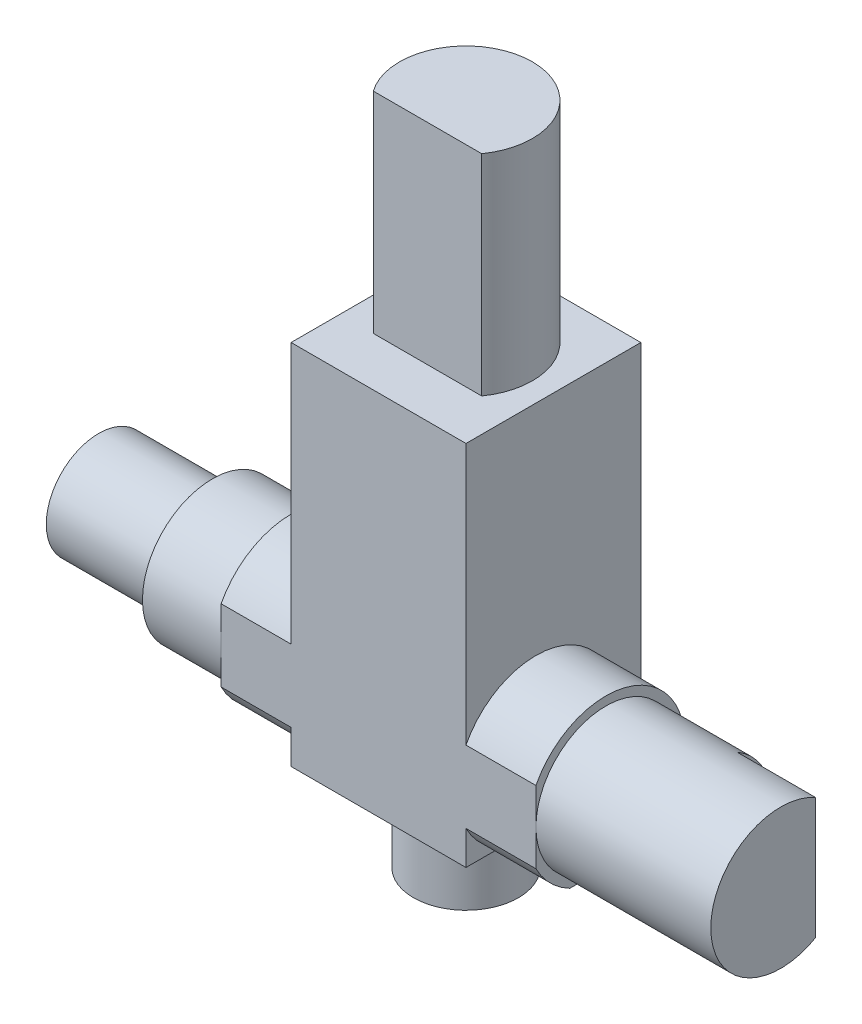
ISO-10303-21;
HEADER;
FILE_DESCRIPTION(('STEP AP214'),'2;1');
FILE_NAME('part.step','',(''),(''),'','','');
FILE_SCHEMA(('AUTOMOTIVE_DESIGN { 1 0 10303 214 1 1 1 1 }'));
ENDSEC;
DATA;
#1=APPLICATION_CONTEXT('core data for automotive mechanical design processes');
#2=APPLICATION_PROTOCOL_DEFINITION('international standard','automotive_design',2000,#1);
#3=PRODUCT_CONTEXT('',#1,'mechanical');
#4=PRODUCT('Part','Part','',(#3));
#5=PRODUCT_RELATED_PRODUCT_CATEGORY('part','',(#4));
#6=PRODUCT_DEFINITION_FORMATION('','',#4);
#7=PRODUCT_DEFINITION_CONTEXT('part definition',#1,'design');
#8=PRODUCT_DEFINITION('design','',#6,#7);
#9=PRODUCT_DEFINITION_SHAPE('','',#8);
#10=(LENGTH_UNIT() NAMED_UNIT(*) SI_UNIT(.MILLI.,.METRE.));
#11=(NAMED_UNIT(*) PLANE_ANGLE_UNIT() SI_UNIT($,.RADIAN.));
#12=(NAMED_UNIT(*) SI_UNIT($,.STERADIAN.) SOLID_ANGLE_UNIT());
#13=UNCERTAINTY_MEASURE_WITH_UNIT(LENGTH_MEASURE(1.E-05),#10,'distance_accuracy_value','');
#14=(GEOMETRIC_REPRESENTATION_CONTEXT(3) GLOBAL_UNCERTAINTY_ASSIGNED_CONTEXT((#13)) GLOBAL_UNIT_ASSIGNED_CONTEXT((#10,
#11,#12)) REPRESENTATION_CONTEXT('',''));
#15=CARTESIAN_POINT('',(0.,0.,0.));
#16=DIRECTION('',(0.,0.,1.));
#17=DIRECTION('',(1.,0.,0.));
#18=AXIS2_PLACEMENT_3D('',#15,#16,#17);
#19=CARTESIAN_POINT('',(-9.5,4.5,0.5));
#20=DIRECTION('',(1.,0.,0.));
#21=DIRECTION('',(0.,0.,-1.));
#22=AXIS2_PLACEMENT_3D('',#19,#20,#21);
#23=CYLINDRICAL_SURFACE('',#22,2.);
#24=CARTESIAN_POINT('',(-4.5,4.5,0.5));
#25=DIRECTION('',(1.,0.,0.));
#26=DIRECTION('',(0.,0.,-1.));
#27=AXIS2_PLACEMENT_3D('',#24,#25,#26);
#28=CIRCLE('',#27,2.);
#29=CARTESIAN_POINT('',(-4.5,4.5,2.5));
#30=VERTEX_POINT('',#29);
#31=CARTESIAN_POINT('',(-4.5,2.5,0.5));
#32=VERTEX_POINT('',#31);
#33=EDGE_CURVE('E60',#30,#32,#28,.T.);
#34=ORIENTED_EDGE('',*,*,#33,.F.);
#35=EDGE_CURVE('E187',#32,#30,#28,.T.);
#36=ORIENTED_EDGE('',*,*,#35,.F.);
#37=EDGE_LOOP('',(#34,#36));
#38=FACE_BOUND('',#37,.T.);
#39=CARTESIAN_POINT('',(-6.75,4.5,0.5));
#40=DIRECTION('',(-1.,0.,0.));
#41=DIRECTION('',(0.,0.,1.));
#42=AXIS2_PLACEMENT_3D('',#39,#40,#41);
#43=CIRCLE('',#42,2.);
#44=CARTESIAN_POINT('',(-6.75,4.5,2.5));
#45=VERTEX_POINT('',#44);
#46=EDGE_CURVE('E169',#45,#45,#43,.T.);
#47=ORIENTED_EDGE('',*,*,#46,.F.);
#48=EDGE_LOOP('',(#47));
#49=FACE_BOUND('',#48,.T.);
#50=ADVANCED_FACE('F38',(#38,#49),#23,.T.);
#51=CARTESIAN_POINT('',(-4.5,0.,0.));
#52=DIRECTION('',(-1.,0.,0.));
#53=DIRECTION('',(0.,0.,-1.));
#54=AXIS2_PLACEMENT_3D('',#51,#52,#53);
#55=PLANE('',#54);
#56=DIRECTION('',(0.,-1.,0.));
#57=VECTOR('',#56,1.);
#58=CARTESIAN_POINT('',(-4.5,0.,2.5));
#59=LINE('',#58,#57);
#60=CARTESIAN_POINT('',(-4.5,3.46922359359559,2.5));
#61=VERTEX_POINT('',#60);
#62=EDGE_CURVE('E192',#30,#61,#59,.T.);
#63=ORIENTED_EDGE('',*,*,#62,.F.);
#64=ORIENTED_EDGE('',*,*,#33,.T.);
#65=DIRECTION('',(0.,0.,-1.));
#66=VECTOR('',#65,1.);
#67=CARTESIAN_POINT('',(-4.5,2.5,0.));
#68=LINE('',#67,#66);
#69=CARTESIAN_POINT('',(-4.5,2.5,1.53077640640442));
#70=VERTEX_POINT('',#69);
#71=EDGE_CURVE('E196',#70,#32,#68,.T.);
#72=ORIENTED_EDGE('',*,*,#71,.F.);
#73=CARTESIAN_POINT('',(-4.5,4.5,0.5));
#74=DIRECTION('',(1.,0.,0.));
#75=DIRECTION('',(0.,0.,-1.));
#76=AXIS2_PLACEMENT_3D('',#73,#74,#75);
#77=CIRCLE('',#76,2.25);
#78=EDGE_CURVE('E199',#61,#70,#77,.T.);
#79=ORIENTED_EDGE('',*,*,#78,.F.);
#80=EDGE_LOOP('',(#63,#64,#72,#79));
#81=FACE_BOUND('',#80,.T.);
#82=ADVANCED_FACE('F349',(#81),#55,.T.);
#83=CARTESIAN_POINT('',(-2.5,13.,2.5));
#84=DIRECTION('',(1.,0.,0.));
#85=DIRECTION('',(0.,0.,-1.));
#86=AXIS2_PLACEMENT_3D('',#83,#84,#85);
#87=PLANE('',#86);
#88=DIRECTION('',(0.,-1.,0.));
#89=VECTOR('',#88,1.);
#90=CARTESIAN_POINT('',(-2.5,13.,2.5));
#91=LINE('',#90,#89);
#92=CARTESIAN_POINT('',(-2.5,3.46922359359559,2.5));
#93=VERTEX_POINT('',#92);
#94=CARTESIAN_POINT('',(-2.5,2.5,2.5));
#95=VERTEX_POINT('',#94);
#96=EDGE_CURVE('E292',#93,#95,#91,.T.);
#97=ORIENTED_EDGE('',*,*,#96,.F.);
#98=CARTESIAN_POINT('',(-2.5,4.5,0.5));
#99=DIRECTION('',(1.,0.,0.));
#100=DIRECTION('',(0.,0.,-1.));
#101=AXIS2_PLACEMENT_3D('',#98,#99,#100);
#102=CIRCLE('',#101,2.25);
#103=CARTESIAN_POINT('',(-2.5,2.5,1.53077640640442));
#104=VERTEX_POINT('',#103);
#105=EDGE_CURVE('E205',#93,#104,#102,.T.);
#106=ORIENTED_EDGE('',*,*,#105,.T.);
#107=DIRECTION('',(0.,0.,1.));
#108=VECTOR('',#107,1.);
#109=CARTESIAN_POINT('',(-2.5,2.5,2.5));
#110=LINE('',#109,#108);
#111=EDGE_CURVE('E258',#104,#95,#110,.T.);
#112=ORIENTED_EDGE('',*,*,#111,.T.);
#113=EDGE_LOOP('',(#97,#106,#112));
#114=FACE_BOUND('',#113,.T.);
#115=ADVANCED_FACE('F344',(#114),#87,.F.);
#116=CARTESIAN_POINT('',(4.5,0.,0.));
#117=DIRECTION('',(1.,0.,0.));
#118=DIRECTION('',(0.,0.,-1.));
#119=AXIS2_PLACEMENT_3D('',#116,#117,#118);
#120=PLANE('',#119);
#121=CARTESIAN_POINT('',(4.5,4.5,0.5));
#122=DIRECTION('',(1.,0.,0.));
#123=DIRECTION('',(0.,0.,-1.));
#124=AXIS2_PLACEMENT_3D('',#121,#122,#123);
#125=CIRCLE('',#124,2.);
#126=CARTESIAN_POINT('',(4.5,4.5,2.5));
#127=VERTEX_POINT('',#126);
#128=CARTESIAN_POINT('',(4.5,2.5,0.5));
#129=VERTEX_POINT('',#128);
#130=EDGE_CURVE('E215',#127,#129,#125,.T.);
#131=ORIENTED_EDGE('',*,*,#130,.F.);
#132=DIRECTION('',(0.,-1.,0.));
#133=VECTOR('',#132,1.);
#134=CARTESIAN_POINT('',(4.5,0.,2.5));
#135=LINE('',#134,#133);
#136=CARTESIAN_POINT('',(4.5,3.46922359359559,2.5));
#137=VERTEX_POINT('',#136);
#138=EDGE_CURVE('E224',#127,#137,#135,.T.);
#139=ORIENTED_EDGE('',*,*,#138,.T.);
#140=CARTESIAN_POINT('',(4.5,4.5,0.5));
#141=DIRECTION('',(1.,0.,0.));
#142=DIRECTION('',(0.,0.,-1.));
#143=AXIS2_PLACEMENT_3D('',#140,#141,#142);
#144=CIRCLE('',#143,2.25);
#145=CARTESIAN_POINT('',(4.5,2.5,1.53077640640442));
#146=VERTEX_POINT('',#145);
#147=EDGE_CURVE('E223',#137,#146,#144,.T.);
#148=ORIENTED_EDGE('',*,*,#147,.T.);
#149=DIRECTION('',(0.,0.,-1.));
#150=VECTOR('',#149,1.);
#151=CARTESIAN_POINT('',(4.5,2.5,0.));
#152=LINE('',#151,#150);
#153=EDGE_CURVE('E227',#146,#129,#152,.T.);
#154=ORIENTED_EDGE('',*,*,#153,.T.);
#155=EDGE_LOOP('',(#131,#139,#148,#154));
#156=FACE_BOUND('',#155,.T.);
#157=ADVANCED_FACE('F325',(#156),#120,.T.);
#158=CARTESIAN_POINT('',(2.5,13.,2.5));
#159=DIRECTION('',(-1.,0.,0.));
#160=DIRECTION('',(0.,0.,1.));
#161=AXIS2_PLACEMENT_3D('',#158,#159,#160);
#162=PLANE('',#161);
#163=CARTESIAN_POINT('',(2.5,4.5,0.5));
#164=DIRECTION('',(1.,0.,0.));
#165=DIRECTION('',(0.,0.,-1.));
#166=AXIS2_PLACEMENT_3D('',#163,#164,#165);
#167=CIRCLE('',#166,2.25);
#168=CARTESIAN_POINT('',(2.5,2.5,-0.530776406404414));
#169=VERTEX_POINT('',#168);
#170=CARTESIAN_POINT('',(2.5,5.53077640640442,2.5));
#171=VERTEX_POINT('',#170);
#172=EDGE_CURVE('E235',#169,#171,#167,.T.);
#173=ORIENTED_EDGE('',*,*,#172,.F.);
#174=DIRECTION('',(0.,0.,-1.));
#175=VECTOR('',#174,1.);
#176=CARTESIAN_POINT('',(2.5,2.5,2.5));
#177=LINE('',#176,#175);
#178=CARTESIAN_POINT('',(2.5,2.5,-2.5));
#179=VERTEX_POINT('',#178);
#180=EDGE_CURVE('E280',#169,#179,#177,.T.);
#181=ORIENTED_EDGE('',*,*,#180,.T.);
#182=DIRECTION('',(0.,-1.,0.));
#183=VECTOR('',#182,1.);
#184=CARTESIAN_POINT('',(2.5,13.,-2.5));
#185=LINE('',#184,#183);
#186=CARTESIAN_POINT('',(2.5,13.,-2.5));
#187=VERTEX_POINT('',#186);
#188=EDGE_CURVE('E286',#187,#179,#185,.T.);
#189=ORIENTED_EDGE('',*,*,#188,.F.);
#190=DIRECTION('',(0.,0.,-1.));
#191=VECTOR('',#190,1.);
#192=CARTESIAN_POINT('',(2.5,13.,2.5));
#193=LINE('',#192,#191);
#194=CARTESIAN_POINT('',(2.5,13.,2.5));
#195=VERTEX_POINT('',#194);
#196=EDGE_CURVE('E269',#195,#187,#193,.T.);
#197=ORIENTED_EDGE('',*,*,#196,.F.);
#198=DIRECTION('',(0.,-1.,0.));
#199=VECTOR('',#198,1.);
#200=CARTESIAN_POINT('',(2.5,13.,2.5));
#201=LINE('',#200,#199);
#202=EDGE_CURVE('E290',#195,#171,#201,.T.);
#203=ORIENTED_EDGE('',*,*,#202,.T.);
#204=EDGE_LOOP('',(#173,#181,#189,#197,#203));
#205=FACE_BOUND('',#204,.T.);
#206=ADVANCED_FACE('F546',(#205),#162,.F.);
#207=CARTESIAN_POINT('',(0.,2.,0.));
#208=DIRECTION('',(0.,-1.,0.));
#209=DIRECTION('',(0.,0.,-1.));
#210=AXIS2_PLACEMENT_3D('',#207,#208,#209);
#211=CYLINDRICAL_SURFACE('',#210,1.5);
#212=CARTESIAN_POINT('',(0.,2.,0.));
#213=DIRECTION('',(0.,1.,0.));
#214=DIRECTION('',(0.,0.,1.));
#215=AXIS2_PLACEMENT_3D('',#212,#213,#214);
#216=CIRCLE('',#215,1.5);
#217=CARTESIAN_POINT('',(0.,2.,1.5));
#218=VERTEX_POINT('',#217);
#219=EDGE_CURVE('E262',#218,#218,#216,.T.);
#220=ORIENTED_EDGE('',*,*,#219,.F.);
#221=EDGE_LOOP('',(#220));
#222=FACE_BOUND('',#221,.T.);
#223=CARTESIAN_POINT('',(0.,0.,0.));
#224=DIRECTION('',(0.,1.,0.));
#225=DIRECTION('',(0.,0.,1.));
#226=AXIS2_PLACEMENT_3D('',#223,#224,#225);
#227=CIRCLE('',#226,1.5);
#228=CARTESIAN_POINT('',(0.,0.,1.5));
#229=VERTEX_POINT('',#228);
#230=EDGE_CURVE('E300',#229,#229,#227,.T.);
#231=ORIENTED_EDGE('',*,*,#230,.T.);
#232=EDGE_LOOP('',(#231));
#233=FACE_BOUND('',#232,.T.);
#234=ADVANCED_FACE('F40',(#222,#233),#211,.T.);
#235=CARTESIAN_POINT('',(0.,0.,0.));
#236=DIRECTION('',(0.,1.,0.));
#237=DIRECTION('',(0.,0.,1.));
#238=AXIS2_PLACEMENT_3D('',#235,#236,#237);
#239=PLANE('',#238);
#240=ORIENTED_EDGE('',*,*,#230,.F.);
#241=EDGE_LOOP('',(#240));
#242=FACE_BOUND('',#241,.T.);
#243=ADVANCED_FACE('F611',(#242),#239,.F.);
#244=CARTESIAN_POINT('',(0.,2.5,0.));
#245=DIRECTION('',(0.,-1.,0.));
#246=DIRECTION('',(0.,0.,-1.));
#247=AXIS2_PLACEMENT_3D('',#244,#245,#246);
#248=CYLINDRICAL_SURFACE('',#247,2.);
#249=CARTESIAN_POINT('',(0.,2.5,0.));
#250=DIRECTION('',(0.,1.,0.));
#251=DIRECTION('',(0.,0.,1.));
#252=AXIS2_PLACEMENT_3D('',#249,#250,#251);
#253=CIRCLE('',#252,2.);
#254=CARTESIAN_POINT('',(0.,2.5,2.));
#255=VERTEX_POINT('',#254);
#256=EDGE_CURVE('E297',#255,#255,#253,.T.);
#257=ORIENTED_EDGE('',*,*,#256,.F.);
#258=EDGE_LOOP('',(#257));
#259=FACE_BOUND('',#258,.T.);
#260=CARTESIAN_POINT('',(0.,2.,0.));
#261=DIRECTION('',(0.,1.,0.));
#262=DIRECTION('',(0.,0.,1.));
#263=AXIS2_PLACEMENT_3D('',#260,#261,#262);
#264=CIRCLE('',#263,2.);
#265=CARTESIAN_POINT('',(0.,2.,2.));
#266=VERTEX_POINT('',#265);
#267=EDGE_CURVE('E296',#266,#266,#264,.T.);
#268=ORIENTED_EDGE('',*,*,#267,.T.);
#269=EDGE_LOOP('',(#268));
#270=FACE_BOUND('',#269,.T.);
#271=ADVANCED_FACE('F601',(#259,#270),#248,.T.);
#272=CARTESIAN_POINT('',(0.,2.,0.));
#273=DIRECTION('',(0.,1.,0.));
#274=DIRECTION('',(0.,0.,1.));
#275=AXIS2_PLACEMENT_3D('',#272,#273,#274);
#276=PLANE('',#275);
#277=ORIENTED_EDGE('',*,*,#219,.T.);
#278=EDGE_LOOP('',(#277));
#279=FACE_BOUND('',#278,.T.);
#280=ORIENTED_EDGE('',*,*,#267,.F.);
#281=EDGE_LOOP('',(#280));
#282=FACE_BOUND('',#281,.T.);
#283=ADVANCED_FACE('F513',(#279,#282),#276,.F.);
#284=CARTESIAN_POINT('',(-2.5,2.5,-2.5));
#285=VERTEX_POINT('',#284);
#286=CARTESIAN_POINT('',(-2.5,2.5,-0.530776406404414));
#287=VERTEX_POINT('',#286);
#288=EDGE_CURVE('E274',#285,#287,#110,.T.);
#289=ORIENTED_EDGE('',*,*,#288,.T.);
#290=CARTESIAN_POINT('',(-2.5,4.5,0.5));
#291=DIRECTION('',(1.,0.,0.));
#292=DIRECTION('',(0.,0.,-1.));
#293=AXIS2_PLACEMENT_3D('',#290,#291,#292);
#294=CIRCLE('',#293,2.25);
#295=CARTESIAN_POINT('',(-2.5,5.53077640640442,2.5));
#296=VERTEX_POINT('',#295);
#297=EDGE_CURVE('E186',#287,#296,#294,.T.);
#298=ORIENTED_EDGE('',*,*,#297,.T.);
#299=CARTESIAN_POINT('',(-2.5,13.,2.5));
#300=VERTEX_POINT('',#299);
#301=EDGE_CURVE('E293',#300,#296,#91,.T.);
#302=ORIENTED_EDGE('',*,*,#301,.F.);
#303=DIRECTION('',(0.,0.,1.));
#304=VECTOR('',#303,1.);
#305=CARTESIAN_POINT('',(-2.5,13.,2.5));
#306=LINE('',#305,#304);
#307=CARTESIAN_POINT('',(-2.5,13.,-2.5));
#308=VERTEX_POINT('',#307);
#309=EDGE_CURVE('E263',#308,#300,#306,.T.);
#310=ORIENTED_EDGE('',*,*,#309,.F.);
#311=DIRECTION('',(0.,-1.,0.));
#312=VECTOR('',#311,1.);
#313=CARTESIAN_POINT('',(-2.5,13.,-2.5));
#314=LINE('',#313,#312);
#315=EDGE_CURVE('E273',#308,#285,#314,.T.);
#316=ORIENTED_EDGE('',*,*,#315,.T.);
#317=EDGE_LOOP('',(#289,#298,#302,#310,#316));
#318=FACE_BOUND('',#317,.T.);
#319=ADVANCED_FACE('F502',(#318),#87,.F.);
#320=CARTESIAN_POINT('',(2.5,13.,2.5));
#321=DIRECTION('',(0.,0.,-1.));
#322=DIRECTION('',(-1.,0.,0.));
#323=AXIS2_PLACEMENT_3D('',#320,#321,#322);
#324=PLANE('',#323);
#325=DIRECTION('',(1.,0.,0.));
#326=VECTOR('',#325,1.);
#327=CARTESIAN_POINT('',(2.5,2.5,2.5));
#328=LINE('',#327,#326);
#329=CARTESIAN_POINT('',(2.5,2.5,2.5));
#330=VERTEX_POINT('',#329);
#331=EDGE_CURVE('E277',#95,#330,#328,.T.);
#332=ORIENTED_EDGE('',*,*,#331,.T.);
#333=CARTESIAN_POINT('',(2.5,3.46922359359559,2.5));
#334=VERTEX_POINT('',#333);
#335=EDGE_CURVE('E289',#334,#330,#201,.T.);
#336=ORIENTED_EDGE('',*,*,#335,.F.);
#337=DIRECTION('',(-1.,0.,0.));
#338=VECTOR('',#337,1.);
#339=CARTESIAN_POINT('',(4.5,3.46922359359559,2.5));
#340=LINE('',#339,#338);
#341=EDGE_CURVE('E246',#137,#334,#340,.T.);
#342=ORIENTED_EDGE('',*,*,#341,.F.);
#343=ORIENTED_EDGE('',*,*,#138,.F.);
#344=CARTESIAN_POINT('',(4.5,5.53077640640442,2.5));
#345=VERTEX_POINT('',#344);
#346=EDGE_CURVE('E221',#345,#127,#135,.T.);
#347=ORIENTED_EDGE('',*,*,#346,.F.);
#348=DIRECTION('',(-1.,0.,0.));
#349=VECTOR('',#348,1.);
#350=CARTESIAN_POINT('',(4.5,5.53077640640442,2.5));
#351=LINE('',#350,#349);
#352=EDGE_CURVE('E232',#345,#171,#351,.T.);
#353=ORIENTED_EDGE('',*,*,#352,.T.);
#354=ORIENTED_EDGE('',*,*,#202,.F.);
#355=DIRECTION('',(1.,0.,0.));
#356=VECTOR('',#355,1.);
#357=CARTESIAN_POINT('',(2.5,13.,2.5));
#358=LINE('',#357,#356);
#359=EDGE_CURVE('E266',#300,#195,#358,.T.);
#360=ORIENTED_EDGE('',*,*,#359,.F.);
#361=ORIENTED_EDGE('',*,*,#301,.T.);
#362=DIRECTION('',(1.,0.,0.));
#363=VECTOR('',#362,1.);
#364=CARTESIAN_POINT('',(-4.5,5.53077640640442,2.5));
#365=LINE('',#364,#363);
#366=CARTESIAN_POINT('',(-4.5,5.53077640640442,2.5));
#367=VERTEX_POINT('',#366);
#368=EDGE_CURVE('E213',#367,#296,#365,.T.);
#369=ORIENTED_EDGE('',*,*,#368,.F.);
#370=EDGE_CURVE('E188',#367,#30,#59,.T.);
#371=ORIENTED_EDGE('',*,*,#370,.T.);
#372=ORIENTED_EDGE('',*,*,#62,.T.);
#373=DIRECTION('',(1.,0.,0.));
#374=VECTOR('',#373,1.);
#375=CARTESIAN_POINT('',(-4.5,3.46922359359559,2.5));
#376=LINE('',#375,#374);
#377=EDGE_CURVE('E202',#61,#93,#376,.T.);
#378=ORIENTED_EDGE('',*,*,#377,.T.);
#379=ORIENTED_EDGE('',*,*,#96,.T.);
#380=EDGE_LOOP('',(#332,#336,#342,#343,#347,#353,#354,#360,#361,#369,#371,#372,#378,#379));
#381=FACE_BOUND('',#380,.T.);
#382=ADVANCED_FACE('F338',(#381),#324,.F.);
#383=CARTESIAN_POINT('',(2.5,4.5,0.5));
#384=DIRECTION('',(1.,0.,0.));
#385=DIRECTION('',(0.,0.,-1.));
#386=AXIS2_PLACEMENT_3D('',#383,#384,#385);
#387=CIRCLE('',#386,2.25);
#388=CARTESIAN_POINT('',(2.5,2.5,1.53077640640442));
#389=VERTEX_POINT('',#388);
#390=EDGE_CURVE('E217',#334,#389,#387,.T.);
#391=ORIENTED_EDGE('',*,*,#390,.F.);
#392=ORIENTED_EDGE('',*,*,#335,.T.);
#393=EDGE_CURVE('E281',#330,#389,#177,.T.);
#394=ORIENTED_EDGE('',*,*,#393,.T.);
#395=EDGE_LOOP('',(#391,#392,#394));
#396=FACE_BOUND('',#395,.T.);
#397=ADVANCED_FACE('F335',(#396),#162,.F.);
#398=CARTESIAN_POINT('',(2.5,13.,-2.5));
#399=DIRECTION('',(0.,0.,1.));
#400=DIRECTION('',(1.,0.,0.));
#401=AXIS2_PLACEMENT_3D('',#398,#399,#400);
#402=PLANE('',#401);
#403=DIRECTION('',(-1.,0.,0.));
#404=VECTOR('',#403,1.);
#405=CARTESIAN_POINT('',(2.5,2.5,-2.5));
#406=LINE('',#405,#404);
#407=EDGE_CURVE('E267',#179,#285,#406,.T.);
#408=ORIENTED_EDGE('',*,*,#407,.T.);
#409=ORIENTED_EDGE('',*,*,#315,.F.);
#410=DIRECTION('',(-1.,0.,0.));
#411=VECTOR('',#410,1.);
#412=CARTESIAN_POINT('',(2.5,13.,-2.5));
#413=LINE('',#412,#411);
#414=EDGE_CURVE('E271',#187,#308,#413,.T.);
#415=ORIENTED_EDGE('',*,*,#414,.F.);
#416=ORIENTED_EDGE('',*,*,#188,.T.);
#417=EDGE_LOOP('',(#408,#409,#415,#416));
#418=FACE_BOUND('',#417,.T.);
#419=ADVANCED_FACE('F432',(#418),#402,.F.);
#420=CARTESIAN_POINT('',(0.,13.,0.));
#421=DIRECTION('',(0.,1.,0.));
#422=DIRECTION('',(0.,0.,1.));
#423=AXIS2_PLACEMENT_3D('',#420,#421,#422);
#424=PLANE('',#423);
#425=CARTESIAN_POINT('',(0.,13.,0.));
#426=DIRECTION('',(0.,1.,0.));
#427=DIRECTION('',(0.,0.,1.));
#428=AXIS2_PLACEMENT_3D('',#425,#426,#427);
#429=CIRCLE('',#428,1.9);
#430=CARTESIAN_POINT('',(1.54919333848297,13.,1.1));
#431=VERTEX_POINT('',#430);
#432=CARTESIAN_POINT('',(-1.54919333848297,13.,1.1));
#433=VERTEX_POINT('',#432);
#434=EDGE_CURVE('E259',#431,#433,#429,.T.);
#435=ORIENTED_EDGE('',*,*,#434,.F.);
#436=DIRECTION('',(1.,0.,0.));
#437=VECTOR('',#436,1.);
#438=CARTESIAN_POINT('',(-1.54919333848297,13.,1.1));
#439=LINE('',#438,#437);
#440=EDGE_CURVE('E180',#433,#431,#439,.T.);
#441=ORIENTED_EDGE('',*,*,#440,.F.);
#442=EDGE_LOOP('',(#435,#441));
#443=FACE_BOUND('',#442,.T.);
#444=ORIENTED_EDGE('',*,*,#309,.T.);
#445=ORIENTED_EDGE('',*,*,#359,.T.);
#446=ORIENTED_EDGE('',*,*,#196,.T.);
#447=ORIENTED_EDGE('',*,*,#414,.T.);
#448=EDGE_LOOP('',(#444,#445,#446,#447));
#449=FACE_BOUND('',#448,.T.);
#450=ADVANCED_FACE('F427',(#443,#449),#424,.T.);
#451=CARTESIAN_POINT('',(0.,2.5,0.));
#452=DIRECTION('',(0.,1.,0.));
#453=DIRECTION('',(0.,0.,1.));
#454=AXIS2_PLACEMENT_3D('',#451,#452,#453);
#455=PLANE('',#454);
#456=ORIENTED_EDGE('',*,*,#256,.T.);
#457=EDGE_LOOP('',(#456));
#458=FACE_BOUND('',#457,.T.);
#459=ORIENTED_EDGE('',*,*,#288,.F.);
#460=ORIENTED_EDGE('',*,*,#407,.F.);
#461=ORIENTED_EDGE('',*,*,#180,.F.);
#462=DIRECTION('',(-1.,0.,0.));
#463=VECTOR('',#462,1.);
#464=CARTESIAN_POINT('',(4.5,2.5,-0.530776406404414));
#465=LINE('',#464,#463);
#466=CARTESIAN_POINT('',(4.5,2.5,-0.530776406404414));
#467=VERTEX_POINT('',#466);
#468=EDGE_CURVE('E240',#467,#169,#465,.T.);
#469=ORIENTED_EDGE('',*,*,#468,.F.);
#470=EDGE_CURVE('E226',#129,#467,#152,.T.);
#471=ORIENTED_EDGE('',*,*,#470,.F.);
#472=ORIENTED_EDGE('',*,*,#153,.F.);
#473=DIRECTION('',(-1.,0.,0.));
#474=VECTOR('',#473,1.);
#475=CARTESIAN_POINT('',(4.5,2.5,1.53077640640442));
#476=LINE('',#475,#474);
#477=EDGE_CURVE('E243',#146,#389,#476,.T.);
#478=ORIENTED_EDGE('',*,*,#477,.T.);
#479=ORIENTED_EDGE('',*,*,#393,.F.);
#480=ORIENTED_EDGE('',*,*,#331,.F.);
#481=ORIENTED_EDGE('',*,*,#111,.F.);
#482=DIRECTION('',(1.,0.,0.));
#483=VECTOR('',#482,1.);
#484=CARTESIAN_POINT('',(-4.5,2.5,1.53077640640442));
#485=LINE('',#484,#483);
#486=EDGE_CURVE('E209',#70,#104,#485,.T.);
#487=ORIENTED_EDGE('',*,*,#486,.F.);
#488=ORIENTED_EDGE('',*,*,#71,.T.);
#489=CARTESIAN_POINT('',(-4.5,2.5,-0.530776406404414));
#490=VERTEX_POINT('',#489);
#491=EDGE_CURVE('E195',#32,#490,#68,.T.);
#492=ORIENTED_EDGE('',*,*,#491,.T.);
#493=DIRECTION('',(1.,0.,0.));
#494=VECTOR('',#493,1.);
#495=CARTESIAN_POINT('',(-4.5,2.5,-0.530776406404414));
#496=LINE('',#495,#494);
#497=EDGE_CURVE('E211',#490,#287,#496,.T.);
#498=ORIENTED_EDGE('',*,*,#497,.T.);
#499=EDGE_LOOP('',(#459,#460,#461,#469,#471,#472,#478,#479,#480,#481,#487,#488,#492,#498));
#500=FACE_BOUND('',#499,.T.);
#501=ADVANCED_FACE('F321',(#458,#500),#455,.F.);
#502=CARTESIAN_POINT('',(0.,16.5,0.));
#503=DIRECTION('',(0.,-1.,0.));
#504=DIRECTION('',(0.,0.,-1.));
#505=AXIS2_PLACEMENT_3D('',#502,#503,#504);
#506=CYLINDRICAL_SURFACE('',#505,1.9);
#507=DIRECTION('',(0.,-1.,0.));
#508=VECTOR('',#507,1.);
#509=CARTESIAN_POINT('',(1.54919333848297,19.,1.1));
#510=LINE('',#509,#508);
#511=CARTESIAN_POINT('',(1.54919333848297,19.,1.1));
#512=VERTEX_POINT('',#511);
#513=EDGE_CURVE('E254',#512,#431,#510,.T.);
#514=ORIENTED_EDGE('',*,*,#513,.T.);
#515=ORIENTED_EDGE('',*,*,#434,.T.);
#516=DIRECTION('',(0.,-1.,0.));
#517=VECTOR('',#516,1.);
#518=CARTESIAN_POINT('',(-1.54919333848297,19.,1.1));
#519=LINE('',#518,#517);
#520=CARTESIAN_POINT('',(-1.54919333848297,19.,1.1));
#521=VERTEX_POINT('',#520);
#522=EDGE_CURVE('E256',#521,#433,#519,.T.);
#523=ORIENTED_EDGE('',*,*,#522,.F.);
#524=CARTESIAN_POINT('',(0.,19.,0.));
#525=DIRECTION('',(0.,1.,0.));
#526=DIRECTION('',(0.,0.,1.));
#527=AXIS2_PLACEMENT_3D('',#524,#525,#526);
#528=CIRCLE('',#527,1.9);
#529=EDGE_CURVE('E249',#512,#521,#528,.T.);
#530=ORIENTED_EDGE('',*,*,#529,.F.);
#531=EDGE_LOOP('',(#514,#515,#523,#530));
#532=FACE_BOUND('',#531,.T.);
#533=ADVANCED_FACE('F442',(#532),#506,.T.);
#534=CARTESIAN_POINT('',(1.54919333848297,19.,1.1));
#535=DIRECTION('',(0.,0.,-1.));
#536=DIRECTION('',(-1.,0.,0.));
#537=AXIS2_PLACEMENT_3D('',#534,#535,#536);
#538=PLANE('',#537);
#539=ORIENTED_EDGE('',*,*,#522,.T.);
#540=ORIENTED_EDGE('',*,*,#440,.T.);
#541=ORIENTED_EDGE('',*,*,#513,.F.);
#542=DIRECTION('',(1.,0.,0.));
#543=VECTOR('',#542,1.);
#544=CARTESIAN_POINT('',(1.54919333848297,19.,1.1));
#545=LINE('',#544,#543);
#546=EDGE_CURVE('E252',#521,#512,#545,.T.);
#547=ORIENTED_EDGE('',*,*,#546,.F.);
#548=EDGE_LOOP('',(#539,#540,#541,#547));
#549=FACE_BOUND('',#548,.T.);
#550=ADVANCED_FACE('F447',(#549),#538,.F.);
#551=CARTESIAN_POINT('',(0.,19.,0.));
#552=DIRECTION('',(0.,1.,0.));
#553=DIRECTION('',(0.,0.,1.));
#554=AXIS2_PLACEMENT_3D('',#551,#552,#553);
#555=PLANE('',#554);
#556=ORIENTED_EDGE('',*,*,#529,.T.);
#557=ORIENTED_EDGE('',*,*,#546,.T.);
#558=EDGE_LOOP('',(#556,#557));
#559=FACE_BOUND('',#558,.T.);
#560=ADVANCED_FACE('F458',(#559),#555,.T.);
#561=CARTESIAN_POINT('',(4.5,4.5,0.5));
#562=DIRECTION('',(-1.,0.,0.));
#563=DIRECTION('',(0.,0.,1.));
#564=AXIS2_PLACEMENT_3D('',#561,#562,#563);
#565=CYLINDRICAL_SURFACE('',#564,2.25);
#566=ORIENTED_EDGE('',*,*,#390,.T.);
#567=ORIENTED_EDGE('',*,*,#477,.F.);
#568=ORIENTED_EDGE('',*,*,#147,.F.);
#569=ORIENTED_EDGE('',*,*,#341,.T.);
#570=EDGE_LOOP('',(#566,#567,#568,#569));
#571=FACE_BOUND('',#570,.T.);
#572=ADVANCED_FACE('F330',(#571),#565,.T.);
#573=CARTESIAN_POINT('',(4.5,4.5,0.5));
#574=DIRECTION('',(-1.,0.,0.));
#575=DIRECTION('',(0.,0.,1.));
#576=AXIS2_PLACEMENT_3D('',#573,#574,#575);
#577=CYLINDRICAL_SURFACE('',#576,2.25);
#578=ORIENTED_EDGE('',*,*,#172,.T.);
#579=ORIENTED_EDGE('',*,*,#352,.F.);
#580=CARTESIAN_POINT('',(4.5,4.5,0.5));
#581=DIRECTION('',(1.,0.,0.));
#582=DIRECTION('',(0.,0.,-1.));
#583=AXIS2_PLACEMENT_3D('',#580,#581,#582);
#584=CIRCLE('',#583,2.25);
#585=EDGE_CURVE('E230',#467,#345,#584,.T.);
#586=ORIENTED_EDGE('',*,*,#585,.F.);
#587=ORIENTED_EDGE('',*,*,#468,.T.);
#588=EDGE_LOOP('',(#578,#579,#586,#587));
#589=FACE_BOUND('',#588,.T.);
#590=ADVANCED_FACE('F537',(#589),#577,.T.);
#591=EDGE_CURVE('E220',#129,#127,#125,.T.);
#592=ORIENTED_EDGE('',*,*,#591,.F.);
#593=ORIENTED_EDGE('',*,*,#470,.T.);
#594=ORIENTED_EDGE('',*,*,#585,.T.);
#595=ORIENTED_EDGE('',*,*,#346,.T.);
#596=EDGE_LOOP('',(#592,#593,#594,#595));
#597=FACE_BOUND('',#596,.T.);
#598=ADVANCED_FACE('F314',(#597),#120,.T.);
#599=CARTESIAN_POINT('',(9.5,4.5,0.5));
#600=DIRECTION('',(-1.,0.,0.));
#601=DIRECTION('',(0.,0.,1.));
#602=AXIS2_PLACEMENT_3D('',#599,#600,#601);
#603=CYLINDRICAL_SURFACE('',#602,2.);
#604=CARTESIAN_POINT('',(9.5,4.5,0.5));
#605=DIRECTION('',(1.,0.,0.));
#606=DIRECTION('',(0.,0.,-1.));
#607=AXIS2_PLACEMENT_3D('',#604,#605,#606);
#608=CIRCLE('',#607,2.);
#609=CARTESIAN_POINT('',(9.5,6.23205080756888,-0.5));
#610=VERTEX_POINT('',#609);
#611=CARTESIAN_POINT('',(9.5,2.76794919243112,-0.5));
#612=VERTEX_POINT('',#611);
#613=EDGE_CURVE('E178',#610,#612,#608,.T.);
#614=ORIENTED_EDGE('',*,*,#613,.F.);
#615=DIRECTION('',(1.,0.,0.));
#616=VECTOR('',#615,1.);
#617=CARTESIAN_POINT('',(7.25,6.23205080756888,-0.5));
#618=LINE('',#617,#616);
#619=CARTESIAN_POINT('',(7.25,6.23205080756888,-0.5));
#620=VERTEX_POINT('',#619);
#621=EDGE_CURVE('E53',#620,#610,#618,.T.);
#622=ORIENTED_EDGE('',*,*,#621,.F.);
#623=CARTESIAN_POINT('',(7.25,4.5,0.5));
#624=DIRECTION('',(1.,0.,0.));
#625=DIRECTION('',(0.,0.,-1.));
#626=AXIS2_PLACEMENT_3D('',#623,#624,#625);
#627=CIRCLE('',#626,2.);
#628=CARTESIAN_POINT('',(7.25,2.76794919243112,-0.5));
#629=VERTEX_POINT('',#628);
#630=EDGE_CURVE('E164',#629,#620,#627,.T.);
#631=ORIENTED_EDGE('',*,*,#630,.F.);
#632=DIRECTION('',(1.,0.,0.));
#633=VECTOR('',#632,1.);
#634=CARTESIAN_POINT('',(7.25,2.76794919243112,-0.5));
#635=LINE('',#634,#633);
#636=EDGE_CURVE('E172',#629,#612,#635,.T.);
#637=ORIENTED_EDGE('',*,*,#636,.T.);
#638=EDGE_LOOP('',(#614,#622,#631,#637));
#639=FACE_BOUND('',#638,.T.);
#640=ORIENTED_EDGE('',*,*,#130,.T.);
#641=ORIENTED_EDGE('',*,*,#591,.T.);
#642=EDGE_LOOP('',(#640,#641));
#643=FACE_BOUND('',#642,.T.);
#644=ADVANCED_FACE('F175',(#639,#643),#603,.T.);
#645=CARTESIAN_POINT('',(9.5,4.5,0.5));
#646=DIRECTION('',(1.,0.,0.));
#647=DIRECTION('',(0.,0.,-1.));
#648=AXIS2_PLACEMENT_3D('',#645,#646,#647);
#649=PLANE('',#648);
#650=DIRECTION('',(0.,-1.,0.));
#651=VECTOR('',#650,1.);
#652=CARTESIAN_POINT('',(9.5,4.5,-0.5));
#653=LINE('',#652,#651);
#654=EDGE_CURVE('E46',#610,#612,#653,.T.);
#655=ORIENTED_EDGE('',*,*,#654,.F.);
#656=ORIENTED_EDGE('',*,*,#613,.T.);
#657=EDGE_LOOP('',(#655,#656));
#658=FACE_BOUND('',#657,.T.);
#659=ADVANCED_FACE('F360',(#658),#649,.T.);
#660=CARTESIAN_POINT('',(-4.5,4.5,0.5));
#661=DIRECTION('',(1.,0.,0.));
#662=DIRECTION('',(0.,0.,-1.));
#663=AXIS2_PLACEMENT_3D('',#660,#661,#662);
#664=CYLINDRICAL_SURFACE('',#663,2.25);
#665=ORIENTED_EDGE('',*,*,#297,.F.);
#666=ORIENTED_EDGE('',*,*,#497,.F.);
#667=CARTESIAN_POINT('',(-4.5,4.5,0.5));
#668=DIRECTION('',(1.,0.,0.));
#669=DIRECTION('',(0.,0.,-1.));
#670=AXIS2_PLACEMENT_3D('',#667,#668,#669);
#671=CIRCLE('',#670,2.25);
#672=EDGE_CURVE('E191',#490,#367,#671,.T.);
#673=ORIENTED_EDGE('',*,*,#672,.T.);
#674=ORIENTED_EDGE('',*,*,#368,.T.);
#675=EDGE_LOOP('',(#665,#666,#673,#674));
#676=FACE_BOUND('',#675,.T.);
#677=ADVANCED_FACE('F353',(#676),#664,.T.);
#678=CARTESIAN_POINT('',(-4.5,4.5,0.5));
#679=DIRECTION('',(1.,0.,0.));
#680=DIRECTION('',(0.,0.,-1.));
#681=AXIS2_PLACEMENT_3D('',#678,#679,#680);
#682=CYLINDRICAL_SURFACE('',#681,2.25);
#683=ORIENTED_EDGE('',*,*,#105,.F.);
#684=ORIENTED_EDGE('',*,*,#377,.F.);
#685=ORIENTED_EDGE('',*,*,#78,.T.);
#686=ORIENTED_EDGE('',*,*,#486,.T.);
#687=EDGE_LOOP('',(#683,#684,#685,#686));
#688=FACE_BOUND('',#687,.T.);
#689=ADVANCED_FACE('F350',(#688),#682,.T.);
#690=ORIENTED_EDGE('',*,*,#491,.F.);
#691=ORIENTED_EDGE('',*,*,#35,.T.);
#692=ORIENTED_EDGE('',*,*,#370,.F.);
#693=ORIENTED_EDGE('',*,*,#672,.F.);
#694=EDGE_LOOP('',(#690,#691,#692,#693));
#695=FACE_BOUND('',#694,.T.);
#696=ADVANCED_FACE('F352',(#695),#55,.T.);
#697=CARTESIAN_POINT('',(7.25,2.76794919243112,-0.5));
#698=DIRECTION('',(0.,0.,1.));
#699=DIRECTION('',(1.,0.,0.));
#700=AXIS2_PLACEMENT_3D('',#697,#698,#699);
#701=PLANE('',#700);
#702=ORIENTED_EDGE('',*,*,#654,.T.);
#703=ORIENTED_EDGE('',*,*,#636,.F.);
#704=DIRECTION('',(0.,-1.,0.));
#705=VECTOR('',#704,1.);
#706=CARTESIAN_POINT('',(7.25,2.76794919243112,-0.5));
#707=LINE('',#706,#705);
#708=EDGE_CURVE('E166',#620,#629,#707,.T.);
#709=ORIENTED_EDGE('',*,*,#708,.F.);
#710=ORIENTED_EDGE('',*,*,#621,.T.);
#711=EDGE_LOOP('',(#702,#703,#709,#710));
#712=FACE_BOUND('',#711,.T.);
#713=ADVANCED_FACE('F171',(#712),#701,.F.);
#714=CARTESIAN_POINT('',(7.25,4.5,0.5));
#715=DIRECTION('',(1.,0.,0.));
#716=DIRECTION('',(0.,0.,-1.));
#717=AXIS2_PLACEMENT_3D('',#714,#715,#716);
#718=PLANE('',#717);
#719=ORIENTED_EDGE('',*,*,#630,.T.);
#720=ORIENTED_EDGE('',*,*,#708,.T.);
#721=EDGE_LOOP('',(#719,#720));
#722=FACE_BOUND('',#721,.T.);
#723=ADVANCED_FACE('F165',(#722),#718,.T.);
#724=CARTESIAN_POINT('',(-6.75,4.5,0.5));
#725=DIRECTION('',(-1.,0.,0.));
#726=DIRECTION('',(0.,0.,1.));
#727=AXIS2_PLACEMENT_3D('',#724,#725,#726);
#728=PLANE('',#727);
#729=ORIENTED_EDGE('',*,*,#46,.T.);
#730=EDGE_LOOP('',(#729));
#731=FACE_BOUND('',#730,.T.);
#732=CARTESIAN_POINT('',(-6.75,4.5,0.5));
#733=DIRECTION('',(-1.,0.,0.));
#734=DIRECTION('',(0.,0.,1.));
#735=AXIS2_PLACEMENT_3D('',#732,#733,#734);
#736=CIRCLE('',#735,1.5);
#737=CARTESIAN_POINT('',(-6.75,4.5,2.));
#738=VERTEX_POINT('',#737);
#739=EDGE_CURVE('E11',#738,#738,#736,.F.);
#740=ORIENTED_EDGE('',*,*,#739,.T.);
#741=EDGE_LOOP('',(#740));
#742=FACE_BOUND('',#741,.T.);
#743=ADVANCED_FACE('F374',(#731,#742),#728,.T.);
#744=CARTESIAN_POINT('',(-6.25,4.5,0.5));
#745=DIRECTION('',(-1.,0.,0.));
#746=DIRECTION('',(0.,0.,1.));
#747=AXIS2_PLACEMENT_3D('',#744,#745,#746);
#748=CYLINDRICAL_SURFACE('',#747,1.5);
#749=CARTESIAN_POINT('',(-10.,4.5,0.5));
#750=DIRECTION('',(-1.,0.,0.));
#751=DIRECTION('',(0.,0.,1.));
#752=AXIS2_PLACEMENT_3D('',#749,#750,#751);
#753=CIRCLE('',#752,1.5);
#754=CARTESIAN_POINT('',(-10.,4.5,2.));
#755=VERTEX_POINT('',#754);
#756=EDGE_CURVE('E389',#755,#755,#753,.T.);
#757=CARTESIAN_POINT('',(-6.75,4.5,2.));
#758=CARTESIAN_POINT('',(-6.78385416666667,4.5,2.));
#759=CARTESIAN_POINT('',(-6.81770833333334,4.5,2.));
#760=CARTESIAN_POINT('',(-6.88541666666667,4.5,2.));
#761=CARTESIAN_POINT('',(-6.91927083333334,4.5,2.));
#762=CARTESIAN_POINT('',(-6.98697916666667,4.5,2.));
#763=CARTESIAN_POINT('',(-7.02083333333334,4.5,2.));
#764=CARTESIAN_POINT('',(-7.08854166666667,4.5,2.));
#765=CARTESIAN_POINT('',(-7.12239583333334,4.5,2.));
#766=CARTESIAN_POINT('',(-7.19010416666667,4.5,2.));
#767=CARTESIAN_POINT('',(-7.22395833333334,4.5,2.));
#768=CARTESIAN_POINT('',(-7.29166666666667,4.5,2.));
#769=CARTESIAN_POINT('',(-7.32552083333333,4.5,2.));
#770=CARTESIAN_POINT('',(-7.39322916666667,4.5,2.));
#771=CARTESIAN_POINT('',(-7.42708333333333,4.5,2.));
#772=CARTESIAN_POINT('',(-7.49479166666667,4.5,2.));
#773=CARTESIAN_POINT('',(-7.52864583333333,4.5,2.));
#774=CARTESIAN_POINT('',(-7.59635416666667,4.5,2.));
#775=CARTESIAN_POINT('',(-7.63020833333333,4.5,2.));
#776=CARTESIAN_POINT('',(-7.69791666666667,4.5,2.));
#777=CARTESIAN_POINT('',(-7.73177083333334,4.5,2.));
#778=CARTESIAN_POINT('',(-7.79947916666667,4.5,2.));
#779=CARTESIAN_POINT('',(-7.83333333333333,4.5,2.));
#780=CARTESIAN_POINT('',(-7.90104166666667,4.5,2.));
#781=CARTESIAN_POINT('',(-7.93489583333334,4.5,2.));
#782=CARTESIAN_POINT('',(-8.00260416666667,4.5,2.));
#783=CARTESIAN_POINT('',(-8.03645833333333,4.5,2.));
#784=CARTESIAN_POINT('',(-8.10416666666667,4.5,2.));
#785=CARTESIAN_POINT('',(-8.13802083333334,4.5,2.));
#786=CARTESIAN_POINT('',(-8.20572916666667,4.5,2.));
#787=CARTESIAN_POINT('',(-8.23958333333334,4.5,2.));
#788=CARTESIAN_POINT('',(-8.30729166666667,4.5,2.));
#789=CARTESIAN_POINT('',(-8.34114583333333,4.5,2.));
#790=CARTESIAN_POINT('',(-8.40885416666667,4.5,2.));
#791=CARTESIAN_POINT('',(-8.44270833333334,4.5,2.));
#792=CARTESIAN_POINT('',(-8.51041666666667,4.5,2.));
#793=CARTESIAN_POINT('',(-8.54427083333333,4.5,2.));
#794=CARTESIAN_POINT('',(-8.61197916666667,4.5,2.));
#795=CARTESIAN_POINT('',(-8.64583333333334,4.5,2.));
#796=CARTESIAN_POINT('',(-8.71354166666667,4.5,2.));
#797=CARTESIAN_POINT('',(-8.74739583333333,4.5,2.));
#798=CARTESIAN_POINT('',(-8.81510416666667,4.5,2.));
#799=CARTESIAN_POINT('',(-8.84895833333333,4.5,2.));
#800=CARTESIAN_POINT('',(-8.91666666666667,4.5,2.));
#801=CARTESIAN_POINT('',(-8.95052083333333,4.5,2.));
#802=CARTESIAN_POINT('',(-9.01822916666667,4.5,2.));
#803=CARTESIAN_POINT('',(-9.05208333333334,4.5,2.));
#804=CARTESIAN_POINT('',(-9.11979166666667,4.5,2.));
#805=CARTESIAN_POINT('',(-9.15364583333334,4.5,2.));
#806=CARTESIAN_POINT('',(-9.22135416666667,4.5,2.));
#807=CARTESIAN_POINT('',(-9.25520833333333,4.5,2.));
#808=CARTESIAN_POINT('',(-9.32291666666667,4.5,2.));
#809=CARTESIAN_POINT('',(-9.35677083333334,4.5,2.));
#810=CARTESIAN_POINT('',(-9.42447916666667,4.5,2.));
#811=CARTESIAN_POINT('',(-9.45833333333333,4.5,2.));
#812=CARTESIAN_POINT('',(-9.52604166666667,4.5,2.));
#813=CARTESIAN_POINT('',(-9.55989583333334,4.5,2.));
#814=CARTESIAN_POINT('',(-9.62760416666667,4.5,2.));
#815=CARTESIAN_POINT('',(-9.66145833333333,4.5,2.));
#816=CARTESIAN_POINT('',(-9.72916666666667,4.5,2.));
#817=CARTESIAN_POINT('',(-9.76302083333333,4.5,2.));
#818=CARTESIAN_POINT('',(-9.83072916666667,4.5,2.));
#819=CARTESIAN_POINT('',(-9.86458333333333,4.5,2.));
#820=CARTESIAN_POINT('',(-9.93229166666667,4.5,2.));
#821=CARTESIAN_POINT('',(-9.96614583333333,4.5,2.));
#822=CARTESIAN_POINT('',(-10.,4.5,2.));
#823=B_SPLINE_CURVE_WITH_KNOTS('',3,(#757,#758,#759,#760,#761,#762,#763,#764,#765,#766,#767,
#768,#769,#770,#771,#772,#773,#774,#775,#776,#777,#778,#779,#780,#781,#782,#783,#784,#785,#786,
#787,#788,#789,#790,#791,#792,#793,#794,#795,#796,#797,#798,#799,#800,#801,#802,#803,#804,#805,
#806,#807,#808,#809,#810,#811,#812,#813,#814,#815,#816,#817,#818,#819,#820,#821,#822),
.UNSPECIFIED.,.F.,.F.,(4,2,2,2,2,2,2,2,2,2,2,2,2,2,2,2,2,2,2,2,2,2,2,2,2,2,2,2,2,2,2,2,4),(0.,
0.1015625,0.203125,0.3046875,0.40625,0.5078125,0.609375,0.7109375,0.8125,0.9140625,1.015625,
1.1171875,1.21875,1.3203125,1.421875,1.5234375,1.625,1.7265625,1.828125,1.9296875,2.03125,
2.1328125,2.234375,2.3359375,2.4375,2.5390625,2.640625,2.7421875,2.84375,2.9453125,3.046875,
3.1484375,3.25),.UNSPECIFIED.);
#824=EDGE_CURVE('BSEAM375',#738,#755,#823,.T.);
#825=ORIENTED_EDGE('',*,*,#739,.F.);
#826=ORIENTED_EDGE('',*,*,#756,.F.);
#827=ORIENTED_EDGE('',*,*,#824,.T.);
#828=ORIENTED_EDGE('',*,*,#824,.F.);
#829=EDGE_LOOP('',(#825,#827,#826,#828));
#830=FACE_BOUND('',#829,.T.);
#831=ADVANCED_FACE('F375',(#830),#748,.T.);
#832=CARTESIAN_POINT('',(-10.,4.5,0.5));
#833=DIRECTION('',(-1.,0.,0.));
#834=DIRECTION('',(0.,0.,1.));
#835=AXIS2_PLACEMENT_3D('',#832,#833,#834);
#836=PLANE('',#835);
#837=ORIENTED_EDGE('',*,*,#756,.T.);
#838=EDGE_LOOP('',(#837));
#839=FACE_BOUND('',#838,.T.);
#840=ADVANCED_FACE('F378',(#839),#836,.T.);
#841=CLOSED_SHELL('',(#50,#82,#115,#157,#206,#234,#243,#271,#283,#319,#382,#397,#419,#450,#501,
#533,#550,#560,#572,#590,#598,#644,#659,#677,#689,#696,#713,#723,#743,#831,#840));
#842=MANIFOLD_SOLID_BREP('B2',#841);
#843=ADVANCED_BREP_SHAPE_REPRESENTATION('',(#18,#842),#14);
#844=SHAPE_DEFINITION_REPRESENTATION(#9,#843);
ENDSEC;
END-ISO-10303-21;
